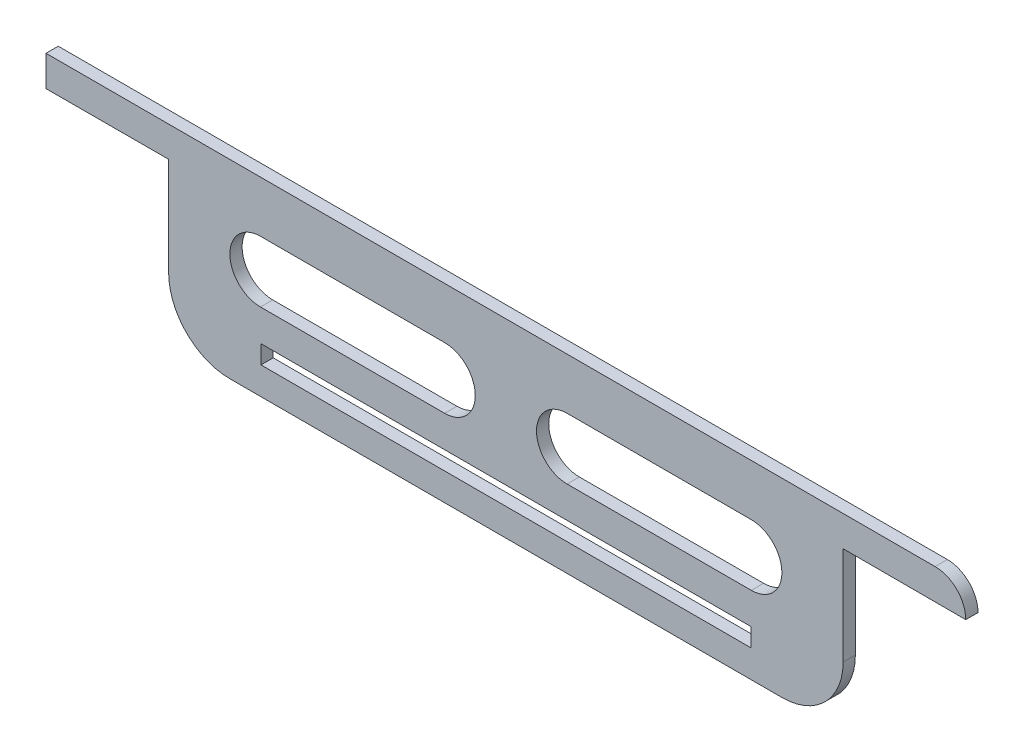
ISO-10303-21;
HEADER;
FILE_DESCRIPTION(('STEP AP214'),'2;1');
FILE_NAME('part.step','',(''),(''),'','','');
FILE_SCHEMA(('AUTOMOTIVE_DESIGN { 1 0 10303 214 1 1 1 1 }'));
ENDSEC;
DATA;
#1=APPLICATION_CONTEXT('core data for automotive mechanical design processes');
#2=APPLICATION_PROTOCOL_DEFINITION('international standard','automotive_design',2000,#1);
#3=PRODUCT_CONTEXT('',#1,'mechanical');
#4=PRODUCT('Part','Part','',(#3));
#5=PRODUCT_RELATED_PRODUCT_CATEGORY('part','',(#4));
#6=PRODUCT_DEFINITION_FORMATION('','',#4);
#7=PRODUCT_DEFINITION_CONTEXT('part definition',#1,'design');
#8=PRODUCT_DEFINITION('design','',#6,#7);
#9=PRODUCT_DEFINITION_SHAPE('','',#8);
#10=(LENGTH_UNIT() NAMED_UNIT(*) SI_UNIT(.MILLI.,.METRE.));
#11=(NAMED_UNIT(*) PLANE_ANGLE_UNIT() SI_UNIT($,.RADIAN.));
#12=(NAMED_UNIT(*) SI_UNIT($,.STERADIAN.) SOLID_ANGLE_UNIT());
#13=UNCERTAINTY_MEASURE_WITH_UNIT(LENGTH_MEASURE(1.E-05),#10,'distance_accuracy_value','');
#14=(GEOMETRIC_REPRESENTATION_CONTEXT(3) GLOBAL_UNCERTAINTY_ASSIGNED_CONTEXT((#13)) GLOBAL_UNIT_ASSIGNED_CONTEXT((#10,
#11,#12)) REPRESENTATION_CONTEXT('',''));
#15=CARTESIAN_POINT('',(0.,0.,0.));
#16=DIRECTION('',(0.,0.,1.));
#17=DIRECTION('',(1.,0.,0.));
#18=AXIS2_PLACEMENT_3D('',#15,#16,#17);
#19=CARTESIAN_POINT('',(40.,0.,2.));
#20=DIRECTION('',(-1.,0.,0.));
#21=DIRECTION('',(0.,0.,1.));
#22=AXIS2_PLACEMENT_3D('',#19,#20,#21);
#23=PLANE('',#22);
#24=DIRECTION('',(0.,1.,0.));
#25=VECTOR('',#24,1.);
#26=CARTESIAN_POINT('',(40.,0.,0.));
#27=LINE('',#26,#25);
#28=CARTESIAN_POINT('',(40.,-24.0218666183001,0.));
#29=VERTEX_POINT('',#28);
#30=CARTESIAN_POINT('',(40.,-21.0218666183001,0.));
#31=VERTEX_POINT('',#30);
#32=EDGE_CURVE('E282',#29,#31,#27,.T.);
#33=ORIENTED_EDGE('',*,*,#32,.F.);
#34=DIRECTION('',(0.,0.,-1.));
#35=VECTOR('',#34,1.);
#36=CARTESIAN_POINT('',(40.,-24.0218666183001,2.));
#37=LINE('',#36,#35);
#38=CARTESIAN_POINT('',(40.,-24.0218666183001,2.));
#39=VERTEX_POINT('',#38);
#40=EDGE_CURVE('E11',#39,#29,#37,.T.);
#41=ORIENTED_EDGE('',*,*,#40,.F.);
#42=DIRECTION('',(0.,1.,0.));
#43=VECTOR('',#42,1.);
#44=CARTESIAN_POINT('',(40.,0.,2.));
#45=LINE('',#44,#43);
#46=CARTESIAN_POINT('',(40.,-21.0218666183001,2.));
#47=VERTEX_POINT('',#46);
#48=EDGE_CURVE('E217',#39,#47,#45,.T.);
#49=ORIENTED_EDGE('',*,*,#48,.T.);
#50=DIRECTION('',(0.,0.,-1.));
#51=VECTOR('',#50,1.);
#52=CARTESIAN_POINT('',(40.,-21.0218666183001,2.));
#53=LINE('',#52,#51);
#54=EDGE_CURVE('E134',#47,#31,#53,.T.);
#55=ORIENTED_EDGE('',*,*,#54,.T.);
#56=EDGE_LOOP('',(#33,#41,#49,#55));
#57=FACE_BOUND('',#56,.T.);
#58=ADVANCED_FACE('F35',(#57),#23,.T.);
#59=CARTESIAN_POINT('',(0.,-24.0218666183001,2.));
#60=DIRECTION('',(0.,1.,0.));
#61=DIRECTION('',(0.,0.,1.));
#62=AXIS2_PLACEMENT_3D('',#59,#60,#61);
#63=PLANE('',#62);
#64=DIRECTION('',(1.,0.,0.));
#65=VECTOR('',#64,1.);
#66=CARTESIAN_POINT('',(0.,-24.0218666183001,0.));
#67=LINE('',#66,#65);
#68=CARTESIAN_POINT('',(-40.,-24.0218666183001,0.));
#69=VERTEX_POINT('',#68);
#70=EDGE_CURVE('E207',#69,#29,#67,.T.);
#71=ORIENTED_EDGE('',*,*,#70,.F.);
#72=DIRECTION('',(0.,0.,-1.));
#73=VECTOR('',#72,1.);
#74=CARTESIAN_POINT('',(-40.,-24.0218666183001,2.));
#75=LINE('',#74,#73);
#76=CARTESIAN_POINT('',(-40.,-24.0218666183001,2.));
#77=VERTEX_POINT('',#76);
#78=EDGE_CURVE('E45',#77,#69,#75,.T.);
#79=ORIENTED_EDGE('',*,*,#78,.F.);
#80=DIRECTION('',(1.,0.,0.));
#81=VECTOR('',#80,1.);
#82=CARTESIAN_POINT('',(0.,-24.0218666183001,2.));
#83=LINE('',#82,#81);
#84=EDGE_CURVE('E205',#77,#39,#83,.T.);
#85=ORIENTED_EDGE('',*,*,#84,.T.);
#86=ORIENTED_EDGE('',*,*,#40,.T.);
#87=EDGE_LOOP('',(#71,#79,#85,#86));
#88=FACE_BOUND('',#87,.T.);
#89=ADVANCED_FACE('F203',(#88),#63,.T.);
#90=CARTESIAN_POINT('',(-40.,0.,2.));
#91=DIRECTION('',(-1.,0.,0.));
#92=DIRECTION('',(0.,0.,1.));
#93=AXIS2_PLACEMENT_3D('',#90,#91,#92);
#94=PLANE('',#93);
#95=DIRECTION('',(0.,1.,0.));
#96=VECTOR('',#95,1.);
#97=CARTESIAN_POINT('',(-40.,0.,0.));
#98=LINE('',#97,#96);
#99=CARTESIAN_POINT('',(-40.,-21.0218666183001,0.));
#100=VERTEX_POINT('',#99);
#101=EDGE_CURVE('E285',#69,#100,#98,.T.);
#102=ORIENTED_EDGE('',*,*,#101,.T.);
#103=DIRECTION('',(0.,0.,-1.));
#104=VECTOR('',#103,1.);
#105=CARTESIAN_POINT('',(-40.,-21.0218666183001,2.));
#106=LINE('',#105,#104);
#107=CARTESIAN_POINT('',(-40.,-21.0218666183001,2.));
#108=VERTEX_POINT('',#107);
#109=EDGE_CURVE('E210',#108,#100,#106,.T.);
#110=ORIENTED_EDGE('',*,*,#109,.F.);
#111=DIRECTION('',(0.,1.,0.));
#112=VECTOR('',#111,1.);
#113=CARTESIAN_POINT('',(-40.,0.,2.));
#114=LINE('',#113,#112);
#115=EDGE_CURVE('E213',#77,#108,#114,.T.);
#116=ORIENTED_EDGE('',*,*,#115,.F.);
#117=ORIENTED_EDGE('',*,*,#78,.T.);
#118=EDGE_LOOP('',(#102,#110,#116,#117));
#119=FACE_BOUND('',#118,.T.);
#120=ADVANCED_FACE('F214',(#119),#94,.F.);
#121=CARTESIAN_POINT('',(70.1093330915004,-2.49635556361665,2.));
#122=DIRECTION('',(0.,0.,-1.));
#123=DIRECTION('',(-1.,0.,0.));
#124=AXIS2_PLACEMENT_3D('',#121,#122,#123);
#125=CYLINDRICAL_SURFACE('',#124,5.);
#126=CARTESIAN_POINT('',(70.1093330915004,-2.49635556361665,0.));
#127=DIRECTION('',(0.,0.,1.));
#128=DIRECTION('',(1.,0.,0.));
#129=AXIS2_PLACEMENT_3D('',#126,#127,#128);
#130=CIRCLE('',#129,5.);
#131=CARTESIAN_POINT('',(70.1093330915004,2.50364443638335,0.));
#132=VERTEX_POINT('',#131);
#133=CARTESIAN_POINT('',(75.1093330915004,-2.49635556361669,0.));
#134=VERTEX_POINT('',#133);
#135=EDGE_CURVE('E249',#132,#134,#130,.F.);
#136=ORIENTED_EDGE('',*,*,#135,.F.);
#137=DIRECTION('',(0.,0.,-1.));
#138=VECTOR('',#137,1.);
#139=CARTESIAN_POINT('',(70.1093330915004,2.50364443638335,2.));
#140=LINE('',#139,#138);
#141=CARTESIAN_POINT('',(70.1093330915004,2.50364443638335,2.));
#142=VERTEX_POINT('',#141);
#143=EDGE_CURVE('E290',#142,#132,#140,.T.);
#144=ORIENTED_EDGE('',*,*,#143,.F.);
#145=CARTESIAN_POINT('',(70.1093330915004,-2.49635556361665,2.));
#146=DIRECTION('',(0.,0.,1.));
#147=DIRECTION('',(1.,0.,0.));
#148=AXIS2_PLACEMENT_3D('',#145,#146,#147);
#149=CIRCLE('',#148,5.);
#150=CARTESIAN_POINT('',(75.1093330915004,-2.49635556361669,2.));
#151=VERTEX_POINT('',#150);
#152=EDGE_CURVE('E368',#142,#151,#149,.F.);
#153=ORIENTED_EDGE('',*,*,#152,.T.);
#154=DIRECTION('',(0.,0.,-1.));
#155=VECTOR('',#154,1.);
#156=CARTESIAN_POINT('',(75.1093330915004,-2.49635556361669,2.));
#157=LINE('',#156,#155);
#158=EDGE_CURVE('E292',#151,#134,#157,.T.);
#159=ORIENTED_EDGE('',*,*,#158,.T.);
#160=EDGE_LOOP('',(#136,#144,#153,#159));
#161=FACE_BOUND('',#160,.T.);
#162=ADVANCED_FACE('F405',(#161),#125,.T.);
#163=CARTESIAN_POINT('',(0.,2.50364443638335,2.));
#164=DIRECTION('',(0.,1.,0.));
#165=DIRECTION('',(0.,0.,1.));
#166=AXIS2_PLACEMENT_3D('',#163,#164,#165);
#167=PLANE('',#166);
#168=DIRECTION('',(1.,0.,0.));
#169=VECTOR('',#168,1.);
#170=CARTESIAN_POINT('',(0.,2.50364443638335,0.));
#171=LINE('',#170,#169);
#172=CARTESIAN_POINT('',(-75.1093330915004,2.50364443638335,0.));
#173=VERTEX_POINT('',#172);
#174=EDGE_CURVE('E252',#173,#132,#171,.T.);
#175=ORIENTED_EDGE('',*,*,#174,.F.);
#176=DIRECTION('',(0.,0.,-1.));
#177=VECTOR('',#176,1.);
#178=CARTESIAN_POINT('',(-75.1093330915004,2.50364443638335,2.));
#179=LINE('',#178,#177);
#180=CARTESIAN_POINT('',(-75.1093330915004,2.50364443638335,2.));
#181=VERTEX_POINT('',#180);
#182=EDGE_CURVE('E316',#181,#173,#179,.T.);
#183=ORIENTED_EDGE('',*,*,#182,.F.);
#184=DIRECTION('',(1.,0.,0.));
#185=VECTOR('',#184,1.);
#186=CARTESIAN_POINT('',(0.,2.50364443638335,2.));
#187=LINE('',#186,#185);
#188=EDGE_CURVE('E371',#181,#142,#187,.T.);
#189=ORIENTED_EDGE('',*,*,#188,.T.);
#190=ORIENTED_EDGE('',*,*,#143,.T.);
#191=EDGE_LOOP('',(#175,#183,#189,#190));
#192=FACE_BOUND('',#191,.T.);
#193=ADVANCED_FACE('F408',(#192),#167,.T.);
#194=CARTESIAN_POINT('',(-75.1093330915004,0.,2.));
#195=DIRECTION('',(1.,0.,0.));
#196=DIRECTION('',(0.,0.,-1.));
#197=AXIS2_PLACEMENT_3D('',#194,#195,#196);
#198=PLANE('',#197);
#199=DIRECTION('',(0.,-1.,0.));
#200=VECTOR('',#199,1.);
#201=CARTESIAN_POINT('',(-75.1093330915004,0.,0.));
#202=LINE('',#201,#200);
#203=CARTESIAN_POINT('',(-75.1093330915005,-2.50364443638335,0.));
#204=VERTEX_POINT('',#203);
#205=EDGE_CURVE('E255',#173,#204,#202,.T.);
#206=ORIENTED_EDGE('',*,*,#205,.T.);
#207=DIRECTION('',(0.,0.,-1.));
#208=VECTOR('',#207,1.);
#209=CARTESIAN_POINT('',(-75.1093330915005,-2.50364443638335,2.));
#210=LINE('',#209,#208);
#211=CARTESIAN_POINT('',(-75.1093330915005,-2.50364443638335,2.));
#212=VERTEX_POINT('',#211);
#213=EDGE_CURVE('E313',#212,#204,#210,.T.);
#214=ORIENTED_EDGE('',*,*,#213,.F.);
#215=DIRECTION('',(0.,-1.,0.));
#216=VECTOR('',#215,1.);
#217=CARTESIAN_POINT('',(-75.1093330915004,0.,2.));
#218=LINE('',#217,#216);
#219=EDGE_CURVE('E374',#181,#212,#218,.T.);
#220=ORIENTED_EDGE('',*,*,#219,.F.);
#221=ORIENTED_EDGE('',*,*,#182,.T.);
#222=EDGE_LOOP('',(#206,#214,#220,#221));
#223=FACE_BOUND('',#222,.T.);
#224=ADVANCED_FACE('F414',(#223),#198,.F.);
#225=CARTESIAN_POINT('',(0.00306702688126153,-2.40797407486067,2.));
#226=DIRECTION('',(-0.00127369493943616,0.999999188850272,0.));
#227=DIRECTION('',(-0.999999188850272,-0.00127369493943616,0.));
#228=AXIS2_PLACEMENT_3D('',#225,#226,#227);
#229=PLANE('',#228);
#230=DIRECTION('',(0.999999188850272,0.00127369493943616,0.));
#231=VECTOR('',#230,1.);
#232=CARTESIAN_POINT('',(0.00306702688126153,-2.40797407486067,0.));
#233=LINE('',#232,#231);
#234=CARTESIAN_POINT('',(-55.0801776004337,-2.47813338169991,0.));
#235=VERTEX_POINT('',#234);
#236=EDGE_CURVE('E258',#204,#235,#233,.T.);
#237=ORIENTED_EDGE('',*,*,#236,.T.);
#238=DIRECTION('',(0.,0.,-1.));
#239=VECTOR('',#238,1.);
#240=CARTESIAN_POINT('',(-55.0801776004337,-2.47813338169991,2.));
#241=LINE('',#240,#239);
#242=CARTESIAN_POINT('',(-55.0801776004337,-2.47813338169991,2.));
#243=VERTEX_POINT('',#242);
#244=EDGE_CURVE('E311',#243,#235,#241,.T.);
#245=ORIENTED_EDGE('',*,*,#244,.F.);
#246=DIRECTION('',(0.999999188850272,0.00127369493943616,0.));
#247=VECTOR('',#246,1.);
#248=CARTESIAN_POINT('',(0.00306702688126153,-2.40797407486067,2.));
#249=LINE('',#248,#247);
#250=EDGE_CURVE('E377',#212,#243,#249,.T.);
#251=ORIENTED_EDGE('',*,*,#250,.F.);
#252=ORIENTED_EDGE('',*,*,#213,.T.);
#253=EDGE_LOOP('',(#237,#245,#251,#252));
#254=FACE_BOUND('',#253,.T.);
#255=ADVANCED_FACE('F417',(#254),#229,.F.);
#256=CARTESIAN_POINT('',(-55.0801776004337,0.,2.));
#257=DIRECTION('',(-1.,0.,0.));
#258=DIRECTION('',(0.,0.,1.));
#259=AXIS2_PLACEMENT_3D('',#256,#257,#258);
#260=PLANE('',#259);
#261=DIRECTION('',(0.,1.,0.));
#262=VECTOR('',#261,1.);
#263=CARTESIAN_POINT('',(-55.0801776004337,0.,0.));
#264=LINE('',#263,#262);
#265=CARTESIAN_POINT('',(-55.0801776004337,-18.5218666183001,0.));
#266=VERTEX_POINT('',#265);
#267=EDGE_CURVE('E261',#266,#235,#264,.T.);
#268=ORIENTED_EDGE('',*,*,#267,.F.);
#269=DIRECTION('',(0.,0.,-1.));
#270=VECTOR('',#269,1.);
#271=CARTESIAN_POINT('',(-55.0801776004337,-18.5218666183001,2.));
#272=LINE('',#271,#270);
#273=CARTESIAN_POINT('',(-55.0801776004337,-18.5218666183001,2.));
#274=VERTEX_POINT('',#273);
#275=EDGE_CURVE('E309',#274,#266,#272,.T.);
#276=ORIENTED_EDGE('',*,*,#275,.F.);
#277=DIRECTION('',(0.,1.,0.));
#278=VECTOR('',#277,1.);
#279=CARTESIAN_POINT('',(-55.0801776004337,0.,2.));
#280=LINE('',#279,#278);
#281=EDGE_CURVE('E379',#274,#243,#280,.T.);
#282=ORIENTED_EDGE('',*,*,#281,.T.);
#283=ORIENTED_EDGE('',*,*,#244,.T.);
#284=EDGE_LOOP('',(#268,#276,#282,#283));
#285=FACE_BOUND('',#284,.T.);
#286=ADVANCED_FACE('F420',(#285),#260,.T.);
#287=CARTESIAN_POINT('',(-45.0801776004337,-18.5218666183001,2.));
#288=DIRECTION('',(0.,0.,-1.));
#289=DIRECTION('',(-1.,0.,0.));
#290=AXIS2_PLACEMENT_3D('',#287,#288,#289);
#291=CYLINDRICAL_SURFACE('',#290,10.);
#292=CARTESIAN_POINT('',(-45.0801776004337,-18.5218666183001,0.));
#293=DIRECTION('',(0.,0.,1.));
#294=DIRECTION('',(1.,0.,0.));
#295=AXIS2_PLACEMENT_3D('',#292,#293,#294);
#296=CIRCLE('',#295,10.);
#297=CARTESIAN_POINT('',(-45.0801776004337,-28.5218666183001,0.));
#298=VERTEX_POINT('',#297);
#299=EDGE_CURVE('E264',#298,#266,#296,.F.);
#300=ORIENTED_EDGE('',*,*,#299,.F.);
#301=DIRECTION('',(0.,0.,-1.));
#302=VECTOR('',#301,1.);
#303=CARTESIAN_POINT('',(-45.0801776004337,-28.5218666183001,2.));
#304=LINE('',#303,#302);
#305=CARTESIAN_POINT('',(-45.0801776004337,-28.5218666183001,2.));
#306=VERTEX_POINT('',#305);
#307=EDGE_CURVE('E307',#306,#298,#304,.T.);
#308=ORIENTED_EDGE('',*,*,#307,.F.);
#309=CARTESIAN_POINT('',(-45.0801776004337,-18.5218666183001,2.));
#310=DIRECTION('',(0.,0.,1.));
#311=DIRECTION('',(1.,0.,0.));
#312=AXIS2_PLACEMENT_3D('',#309,#310,#311);
#313=CIRCLE('',#312,10.);
#314=EDGE_CURVE('E382',#306,#274,#313,.F.);
#315=ORIENTED_EDGE('',*,*,#314,.T.);
#316=ORIENTED_EDGE('',*,*,#275,.T.);
#317=EDGE_LOOP('',(#300,#308,#315,#316));
#318=FACE_BOUND('',#317,.T.);
#319=ADVANCED_FACE('F424',(#318),#291,.T.);
#320=CARTESIAN_POINT('',(0.,-28.5218666183001,2.));
#321=DIRECTION('',(0.,1.,0.));
#322=DIRECTION('',(0.,0.,1.));
#323=AXIS2_PLACEMENT_3D('',#320,#321,#322);
#324=PLANE('',#323);
#325=DIRECTION('',(1.,0.,0.));
#326=VECTOR('',#325,1.);
#327=CARTESIAN_POINT('',(0.,-28.5218666183001,0.));
#328=LINE('',#327,#326);
#329=CARTESIAN_POINT('',(45.0801776004337,-28.5218666183001,0.));
#330=VERTEX_POINT('',#329);
#331=EDGE_CURVE('E267',#298,#330,#328,.T.);
#332=ORIENTED_EDGE('',*,*,#331,.T.);
#333=DIRECTION('',(0.,0.,-1.));
#334=VECTOR('',#333,1.);
#335=CARTESIAN_POINT('',(45.0801776004337,-28.5218666183001,2.));
#336=LINE('',#335,#334);
#337=CARTESIAN_POINT('',(45.0801776004337,-28.5218666183001,2.));
#338=VERTEX_POINT('',#337);
#339=EDGE_CURVE('E304',#338,#330,#336,.T.);
#340=ORIENTED_EDGE('',*,*,#339,.F.);
#341=DIRECTION('',(1.,0.,0.));
#342=VECTOR('',#341,1.);
#343=CARTESIAN_POINT('',(0.,-28.5218666183001,2.));
#344=LINE('',#343,#342);
#345=EDGE_CURVE('E385',#306,#338,#344,.T.);
#346=ORIENTED_EDGE('',*,*,#345,.F.);
#347=ORIENTED_EDGE('',*,*,#307,.T.);
#348=EDGE_LOOP('',(#332,#340,#346,#347));
#349=FACE_BOUND('',#348,.T.);
#350=ADVANCED_FACE('F429',(#349),#324,.F.);
#351=CARTESIAN_POINT('',(45.0801776004337,-18.5218666183001,2.));
#352=DIRECTION('',(0.,0.,-1.));
#353=DIRECTION('',(-1.,0.,0.));
#354=AXIS2_PLACEMENT_3D('',#351,#352,#353);
#355=CYLINDRICAL_SURFACE('',#354,10.);
#356=CARTESIAN_POINT('',(45.0801776004337,-18.5218666183001,0.));
#357=DIRECTION('',(0.,0.,1.));
#358=DIRECTION('',(1.,0.,0.));
#359=AXIS2_PLACEMENT_3D('',#356,#357,#358);
#360=CIRCLE('',#359,10.);
#361=CARTESIAN_POINT('',(55.0801776004337,-18.5218666183001,0.));
#362=VERTEX_POINT('',#361);
#363=EDGE_CURVE('E270',#330,#362,#360,.T.);
#364=ORIENTED_EDGE('',*,*,#363,.T.);
#365=DIRECTION('',(0.,0.,-1.));
#366=VECTOR('',#365,1.);
#367=CARTESIAN_POINT('',(55.0801776004337,-18.5218666183001,2.));
#368=LINE('',#367,#366);
#369=CARTESIAN_POINT('',(55.0801776004337,-18.5218666183001,2.));
#370=VERTEX_POINT('',#369);
#371=EDGE_CURVE('E301',#370,#362,#368,.T.);
#372=ORIENTED_EDGE('',*,*,#371,.F.);
#373=CARTESIAN_POINT('',(45.0801776004337,-18.5218666183001,2.));
#374=DIRECTION('',(0.,0.,1.));
#375=DIRECTION('',(1.,0.,0.));
#376=AXIS2_PLACEMENT_3D('',#373,#374,#375);
#377=CIRCLE('',#376,10.);
#378=EDGE_CURVE('E388',#338,#370,#377,.T.);
#379=ORIENTED_EDGE('',*,*,#378,.F.);
#380=ORIENTED_EDGE('',*,*,#339,.T.);
#381=EDGE_LOOP('',(#364,#372,#379,#380));
#382=FACE_BOUND('',#381,.T.);
#383=ADVANCED_FACE('F433',(#382),#355,.T.);
#384=CARTESIAN_POINT('',(55.0801776004337,0.,2.));
#385=DIRECTION('',(-1.,0.,0.));
#386=DIRECTION('',(0.,0.,1.));
#387=AXIS2_PLACEMENT_3D('',#384,#385,#386);
#388=PLANE('',#387);
#389=DIRECTION('',(0.,1.,0.));
#390=VECTOR('',#389,1.);
#391=CARTESIAN_POINT('',(55.0801776004337,0.,0.));
#392=LINE('',#391,#390);
#393=CARTESIAN_POINT('',(55.0801776004337,-2.47813338169991,0.));
#394=VERTEX_POINT('',#393);
#395=EDGE_CURVE('E273',#362,#394,#392,.T.);
#396=ORIENTED_EDGE('',*,*,#395,.T.);
#397=DIRECTION('',(0.,0.,-1.));
#398=VECTOR('',#397,1.);
#399=CARTESIAN_POINT('',(55.0801776004337,-2.47813338169991,2.));
#400=LINE('',#399,#398);
#401=CARTESIAN_POINT('',(55.0801776004337,-2.47813338169991,2.));
#402=VERTEX_POINT('',#401);
#403=EDGE_CURVE('E298',#402,#394,#400,.T.);
#404=ORIENTED_EDGE('',*,*,#403,.F.);
#405=DIRECTION('',(0.,1.,0.));
#406=VECTOR('',#405,1.);
#407=CARTESIAN_POINT('',(55.0801776004337,0.,2.));
#408=LINE('',#407,#406);
#409=EDGE_CURVE('E391',#370,#402,#408,.T.);
#410=ORIENTED_EDGE('',*,*,#409,.F.);
#411=ORIENTED_EDGE('',*,*,#371,.T.);
#412=EDGE_LOOP('',(#396,#404,#410,#411));
#413=FACE_BOUND('',#412,.T.);
#414=ADVANCED_FACE('F435',(#413),#388,.F.);
#415=CARTESIAN_POINT('',(-0.00306702688126153,-2.40797407486067,2.));
#416=DIRECTION('',(0.00127369493943616,0.999999188850272,0.));
#417=DIRECTION('',(-0.999999188850272,0.00127369493943616,0.));
#418=AXIS2_PLACEMENT_3D('',#415,#416,#417);
#419=PLANE('',#418);
#420=DIRECTION('',(0.999999188850272,-0.00127369493943616,0.));
#421=VECTOR('',#420,1.);
#422=CARTESIAN_POINT('',(-0.00306702688126153,-2.40797407486067,0.));
#423=LINE('',#422,#421);
#424=CARTESIAN_POINT('',(75.1093330915004,-2.50364443638335,0.));
#425=VERTEX_POINT('',#424);
#426=EDGE_CURVE('E276',#394,#425,#423,.T.);
#427=ORIENTED_EDGE('',*,*,#426,.T.);
#428=DIRECTION('',(0.,0.,-1.));
#429=VECTOR('',#428,1.);
#430=CARTESIAN_POINT('',(75.1093330915004,-2.50364443638335,2.));
#431=LINE('',#430,#429);
#432=CARTESIAN_POINT('',(75.1093330915004,-2.50364443638335,2.));
#433=VERTEX_POINT('',#432);
#434=EDGE_CURVE('E294',#433,#425,#431,.T.);
#435=ORIENTED_EDGE('',*,*,#434,.F.);
#436=DIRECTION('',(0.999999188850272,-0.00127369493943616,0.));
#437=VECTOR('',#436,1.);
#438=CARTESIAN_POINT('',(-0.00306702688126153,-2.40797407486067,2.));
#439=LINE('',#438,#437);
#440=EDGE_CURVE('E394',#402,#433,#439,.T.);
#441=ORIENTED_EDGE('',*,*,#440,.F.);
#442=ORIENTED_EDGE('',*,*,#403,.T.);
#443=EDGE_LOOP('',(#427,#435,#441,#442));
#444=FACE_BOUND('',#443,.T.);
#445=ADVANCED_FACE('F437',(#444),#419,.F.);
#446=CARTESIAN_POINT('',(-9.99999999999999,-10.8680576994254,2.));
#447=DIRECTION('',(0.,0.,-1.));
#448=DIRECTION('',(-1.,0.,0.));
#449=AXIS2_PLACEMENT_3D('',#446,#447,#448);
#450=CYLINDRICAL_SURFACE('',#449,5.);
#451=CARTESIAN_POINT('',(-9.99999999999999,-10.8680576994254,0.));
#452=DIRECTION('',(0.,0.,1.));
#453=DIRECTION('',(1.,0.,0.));
#454=AXIS2_PLACEMENT_3D('',#451,#452,#453);
#455=CIRCLE('',#454,5.);
#456=CARTESIAN_POINT('',(-9.99999999999999,-15.8680576994254,0.));
#457=VERTEX_POINT('',#456);
#458=CARTESIAN_POINT('',(-9.99999999999999,-5.86805769942545,0.));
#459=VERTEX_POINT('',#458);
#460=EDGE_CURVE('E237',#457,#459,#455,.T.);
#461=ORIENTED_EDGE('',*,*,#460,.F.);
#462=DIRECTION('',(0.,0.,-1.));
#463=VECTOR('',#462,1.);
#464=CARTESIAN_POINT('',(-9.99999999999999,-15.8680576994254,2.));
#465=LINE('',#464,#463);
#466=CARTESIAN_POINT('',(-9.99999999999999,-15.8680576994254,2.));
#467=VERTEX_POINT('',#466);
#468=EDGE_CURVE('E295',#467,#457,#465,.T.);
#469=ORIENTED_EDGE('',*,*,#468,.F.);
#470=CARTESIAN_POINT('',(-9.99999999999999,-10.8680576994254,2.));
#471=DIRECTION('',(0.,0.,1.));
#472=DIRECTION('',(1.,0.,0.));
#473=AXIS2_PLACEMENT_3D('',#470,#471,#472);
#474=CIRCLE('',#473,5.);
#475=CARTESIAN_POINT('',(-9.99999999999999,-5.86805769942545,2.));
#476=VERTEX_POINT('',#475);
#477=EDGE_CURVE('E351',#467,#476,#474,.T.);
#478=ORIENTED_EDGE('',*,*,#477,.T.);
#479=DIRECTION('',(0.,0.,-1.));
#480=VECTOR('',#479,1.);
#481=CARTESIAN_POINT('',(-9.99999999999999,-5.86805769942545,2.));
#482=LINE('',#481,#480);
#483=EDGE_CURVE('E319',#476,#459,#482,.T.);
#484=ORIENTED_EDGE('',*,*,#483,.T.);
#485=EDGE_LOOP('',(#461,#469,#478,#484));
#486=FACE_BOUND('',#485,.T.);
#487=ADVANCED_FACE('F454',(#486),#450,.F.);
#488=CARTESIAN_POINT('',(0.,-15.8680576994254,2.));
#489=DIRECTION('',(0.,1.,0.));
#490=DIRECTION('',(0.,0.,1.));
#491=AXIS2_PLACEMENT_3D('',#488,#489,#490);
#492=PLANE('',#491);
#493=DIRECTION('',(1.,0.,0.));
#494=VECTOR('',#493,1.);
#495=CARTESIAN_POINT('',(0.,-15.8680576994254,0.));
#496=LINE('',#495,#494);
#497=CARTESIAN_POINT('',(-40.0801776004337,-15.8680576994254,0.));
#498=VERTEX_POINT('',#497);
#499=EDGE_CURVE('E240',#498,#457,#496,.T.);
#500=ORIENTED_EDGE('',*,*,#499,.F.);
#501=DIRECTION('',(0.,0.,-1.));
#502=VECTOR('',#501,1.);
#503=CARTESIAN_POINT('',(-40.0801776004337,-15.8680576994254,2.));
#504=LINE('',#503,#502);
#505=CARTESIAN_POINT('',(-40.0801776004337,-15.8680576994254,2.));
#506=VERTEX_POINT('',#505);
#507=EDGE_CURVE('E323',#506,#498,#504,.T.);
#508=ORIENTED_EDGE('',*,*,#507,.F.);
#509=DIRECTION('',(1.,0.,0.));
#510=VECTOR('',#509,1.);
#511=CARTESIAN_POINT('',(0.,-15.8680576994254,2.));
#512=LINE('',#511,#510);
#513=EDGE_CURVE('E360',#506,#467,#512,.T.);
#514=ORIENTED_EDGE('',*,*,#513,.T.);
#515=ORIENTED_EDGE('',*,*,#468,.T.);
#516=EDGE_LOOP('',(#500,#508,#514,#515));
#517=FACE_BOUND('',#516,.T.);
#518=ADVANCED_FACE('F479',(#517),#492,.T.);
#519=CARTESIAN_POINT('',(-40.0801776004337,-10.8680576994254,2.));
#520=DIRECTION('',(0.,0.,-1.));
#521=DIRECTION('',(-1.,0.,0.));
#522=AXIS2_PLACEMENT_3D('',#519,#520,#521);
#523=CYLINDRICAL_SURFACE('',#522,5.);
#524=CARTESIAN_POINT('',(-40.0801776004337,-10.8680576994254,0.));
#525=DIRECTION('',(0.,0.,1.));
#526=DIRECTION('',(1.,0.,0.));
#527=AXIS2_PLACEMENT_3D('',#524,#525,#526);
#528=CIRCLE('',#527,5.);
#529=CARTESIAN_POINT('',(-40.0801776004337,-5.86805769942545,0.));
#530=VERTEX_POINT('',#529);
#531=EDGE_CURVE('E243',#530,#498,#528,.T.);
#532=ORIENTED_EDGE('',*,*,#531,.F.);
#533=DIRECTION('',(0.,0.,-1.));
#534=VECTOR('',#533,1.);
#535=CARTESIAN_POINT('',(-40.0801776004337,-5.86805769942545,2.));
#536=LINE('',#535,#534);
#537=CARTESIAN_POINT('',(-40.0801776004337,-5.86805769942545,2.));
#538=VERTEX_POINT('',#537);
#539=EDGE_CURVE('E321',#538,#530,#536,.T.);
#540=ORIENTED_EDGE('',*,*,#539,.F.);
#541=CARTESIAN_POINT('',(-40.0801776004337,-10.8680576994254,2.));
#542=DIRECTION('',(0.,0.,1.));
#543=DIRECTION('',(1.,0.,0.));
#544=AXIS2_PLACEMENT_3D('',#541,#542,#543);
#545=CIRCLE('',#544,5.);
#546=EDGE_CURVE('E363',#538,#506,#545,.T.);
#547=ORIENTED_EDGE('',*,*,#546,.T.);
#548=ORIENTED_EDGE('',*,*,#507,.T.);
#549=EDGE_LOOP('',(#532,#540,#547,#548));
#550=FACE_BOUND('',#549,.T.);
#551=ADVANCED_FACE('F476',(#550),#523,.F.);
#552=CARTESIAN_POINT('',(40.0801776004337,-10.8680576994254,2.));
#553=DIRECTION('',(0.,0.,-1.));
#554=DIRECTION('',(-1.,0.,0.));
#555=AXIS2_PLACEMENT_3D('',#552,#553,#554);
#556=CYLINDRICAL_SURFACE('',#555,5.);
#557=CARTESIAN_POINT('',(40.0801776004337,-10.8680576994254,0.));
#558=DIRECTION('',(0.,0.,1.));
#559=DIRECTION('',(1.,0.,0.));
#560=AXIS2_PLACEMENT_3D('',#557,#558,#559);
#561=CIRCLE('',#560,5.);
#562=CARTESIAN_POINT('',(40.0801776004337,-15.8680576994254,0.));
#563=VERTEX_POINT('',#562);
#564=CARTESIAN_POINT('',(40.0801776004337,-5.86805769942545,0.));
#565=VERTEX_POINT('',#564);
#566=EDGE_CURVE('E225',#563,#565,#561,.T.);
#567=ORIENTED_EDGE('',*,*,#566,.F.);
#568=DIRECTION('',(0.,0.,-1.));
#569=VECTOR('',#568,1.);
#570=CARTESIAN_POINT('',(40.0801776004337,-15.8680576994254,2.));
#571=LINE('',#570,#569);
#572=CARTESIAN_POINT('',(40.0801776004337,-15.8680576994254,2.));
#573=VERTEX_POINT('',#572);
#574=EDGE_CURVE('E39',#573,#563,#571,.T.);
#575=ORIENTED_EDGE('',*,*,#574,.F.);
#576=CARTESIAN_POINT('',(40.0801776004337,-10.8680576994254,2.));
#577=DIRECTION('',(0.,0.,1.));
#578=DIRECTION('',(1.,0.,0.));
#579=AXIS2_PLACEMENT_3D('',#576,#577,#578);
#580=CIRCLE('',#579,5.);
#581=CARTESIAN_POINT('',(40.0801776004337,-5.86805769942545,2.));
#582=VERTEX_POINT('',#581);
#583=EDGE_CURVE('E288',#573,#582,#580,.T.);
#584=ORIENTED_EDGE('',*,*,#583,.T.);
#585=DIRECTION('',(0.,0.,-1.));
#586=VECTOR('',#585,1.);
#587=CARTESIAN_POINT('',(40.0801776004337,-5.86805769942545,2.));
#588=LINE('',#587,#586);
#589=EDGE_CURVE('E224',#582,#565,#588,.T.);
#590=ORIENTED_EDGE('',*,*,#589,.T.);
#591=EDGE_LOOP('',(#567,#575,#584,#590));
#592=FACE_BOUND('',#591,.T.);
#593=ADVANCED_FACE('F37',(#592),#556,.F.);
#594=CARTESIAN_POINT('',(0.,-15.8680576994254,2.));
#595=DIRECTION('',(0.,1.,0.));
#596=DIRECTION('',(0.,0.,1.));
#597=AXIS2_PLACEMENT_3D('',#594,#595,#596);
#598=PLANE('',#597);
#599=DIRECTION('',(1.,0.,0.));
#600=VECTOR('',#599,1.);
#601=CARTESIAN_POINT('',(0.,-15.8680576994254,0.));
#602=LINE('',#601,#600);
#603=CARTESIAN_POINT('',(10.,-15.8680576994254,0.));
#604=VERTEX_POINT('',#603);
#605=EDGE_CURVE('E228',#604,#563,#602,.T.);
#606=ORIENTED_EDGE('',*,*,#605,.F.);
#607=DIRECTION('',(0.,0.,-1.));
#608=VECTOR('',#607,1.);
#609=CARTESIAN_POINT('',(10.,-15.8680576994254,2.));
#610=LINE('',#609,#608);
#611=CARTESIAN_POINT('',(10.,-15.8680576994254,2.));
#612=VERTEX_POINT('',#611);
#613=EDGE_CURVE('E328',#612,#604,#610,.T.);
#614=ORIENTED_EDGE('',*,*,#613,.F.);
#615=DIRECTION('',(1.,0.,0.));
#616=VECTOR('',#615,1.);
#617=CARTESIAN_POINT('',(0.,-15.8680576994254,2.));
#618=LINE('',#617,#616);
#619=EDGE_CURVE('E337',#612,#573,#618,.T.);
#620=ORIENTED_EDGE('',*,*,#619,.T.);
#621=ORIENTED_EDGE('',*,*,#574,.T.);
#622=EDGE_LOOP('',(#606,#614,#620,#621));
#623=FACE_BOUND('',#622,.T.);
#624=ADVANCED_FACE('F335',(#623),#598,.T.);
#625=CARTESIAN_POINT('',(10.,-10.8680576994254,2.));
#626=DIRECTION('',(0.,0.,-1.));
#627=DIRECTION('',(-1.,0.,0.));
#628=AXIS2_PLACEMENT_3D('',#625,#626,#627);
#629=CYLINDRICAL_SURFACE('',#628,5.);
#630=CARTESIAN_POINT('',(10.,-10.8680576994254,0.));
#631=DIRECTION('',(0.,0.,1.));
#632=DIRECTION('',(1.,0.,0.));
#633=AXIS2_PLACEMENT_3D('',#630,#631,#632);
#634=CIRCLE('',#633,5.);
#635=CARTESIAN_POINT('',(10.,-5.86805769942545,0.));
#636=VERTEX_POINT('',#635);
#637=EDGE_CURVE('E231',#636,#604,#634,.T.);
#638=ORIENTED_EDGE('',*,*,#637,.F.);
#639=DIRECTION('',(0.,0.,-1.));
#640=VECTOR('',#639,1.);
#641=CARTESIAN_POINT('',(10.,-5.86805769942545,2.));
#642=LINE('',#641,#640);
#643=CARTESIAN_POINT('',(10.,-5.86805769942545,2.));
#644=VERTEX_POINT('',#643);
#645=EDGE_CURVE('E327',#644,#636,#642,.T.);
#646=ORIENTED_EDGE('',*,*,#645,.F.);
#647=CARTESIAN_POINT('',(10.,-10.8680576994254,2.));
#648=DIRECTION('',(0.,0.,1.));
#649=DIRECTION('',(1.,0.,0.));
#650=AXIS2_PLACEMENT_3D('',#647,#648,#649);
#651=CIRCLE('',#650,5.);
#652=EDGE_CURVE('E346',#644,#612,#651,.T.);
#653=ORIENTED_EDGE('',*,*,#652,.T.);
#654=ORIENTED_EDGE('',*,*,#613,.T.);
#655=EDGE_LOOP('',(#638,#646,#653,#654));
#656=FACE_BOUND('',#655,.T.);
#657=ADVANCED_FACE('F343',(#656),#629,.F.);
#658=CARTESIAN_POINT('',(75.1093330915004,0.,2.));
#659=DIRECTION('',(-1.,0.,0.));
#660=DIRECTION('',(0.,0.,1.));
#661=AXIS2_PLACEMENT_3D('',#658,#659,#660);
#662=PLANE('',#661);
#663=DIRECTION('',(0.,1.,0.));
#664=VECTOR('',#663,1.);
#665=CARTESIAN_POINT('',(75.1093330915004,0.,0.));
#666=LINE('',#665,#664);
#667=EDGE_CURVE('E279',#425,#134,#666,.T.);
#668=ORIENTED_EDGE('',*,*,#667,.T.);
#669=ORIENTED_EDGE('',*,*,#158,.F.);
#670=DIRECTION('',(0.,1.,0.));
#671=VECTOR('',#670,1.);
#672=CARTESIAN_POINT('',(75.1093330915004,0.,2.));
#673=LINE('',#672,#671);
#674=EDGE_CURVE('E219',#433,#151,#673,.T.);
#675=ORIENTED_EDGE('',*,*,#674,.F.);
#676=ORIENTED_EDGE('',*,*,#434,.T.);
#677=EDGE_LOOP('',(#668,#669,#675,#676));
#678=FACE_BOUND('',#677,.T.);
#679=ADVANCED_FACE('F402',(#678),#662,.F.);
#680=CARTESIAN_POINT('',(0.,-5.86805769942545,2.));
#681=DIRECTION('',(0.,1.,0.));
#682=DIRECTION('',(-1.,0.,0.));
#683=AXIS2_PLACEMENT_3D('',#680,#681,#682);
#684=PLANE('',#683);
#685=DIRECTION('',(1.,0.,0.));
#686=VECTOR('',#685,1.);
#687=CARTESIAN_POINT('',(0.,-5.86805769942545,0.));
#688=LINE('',#687,#686);
#689=EDGE_CURVE('E246',#530,#459,#688,.T.);
#690=ORIENTED_EDGE('',*,*,#689,.T.);
#691=ORIENTED_EDGE('',*,*,#483,.F.);
#692=DIRECTION('',(1.,0.,0.));
#693=VECTOR('',#692,1.);
#694=CARTESIAN_POINT('',(0.,-5.86805769942545,2.));
#695=LINE('',#694,#693);
#696=EDGE_CURVE('E366',#538,#476,#695,.T.);
#697=ORIENTED_EDGE('',*,*,#696,.F.);
#698=ORIENTED_EDGE('',*,*,#539,.T.);
#699=EDGE_LOOP('',(#690,#691,#697,#698));
#700=FACE_BOUND('',#699,.T.);
#701=ADVANCED_FACE('F451',(#700),#684,.F.);
#702=CARTESIAN_POINT('',(0.,-5.86805769942545,2.));
#703=DIRECTION('',(0.,1.,0.));
#704=DIRECTION('',(-1.,0.,0.));
#705=AXIS2_PLACEMENT_3D('',#702,#703,#704);
#706=PLANE('',#705);
#707=DIRECTION('',(1.,0.,0.));
#708=VECTOR('',#707,1.);
#709=CARTESIAN_POINT('',(0.,-5.86805769942545,0.));
#710=LINE('',#709,#708);
#711=EDGE_CURVE('E234',#636,#565,#710,.T.);
#712=ORIENTED_EDGE('',*,*,#711,.T.);
#713=ORIENTED_EDGE('',*,*,#589,.F.);
#714=DIRECTION('',(1.,0.,0.));
#715=VECTOR('',#714,1.);
#716=CARTESIAN_POINT('',(0.,-5.86805769942545,2.));
#717=LINE('',#716,#715);
#718=EDGE_CURVE('E348',#644,#582,#717,.T.);
#719=ORIENTED_EDGE('',*,*,#718,.F.);
#720=ORIENTED_EDGE('',*,*,#645,.T.);
#721=EDGE_LOOP('',(#712,#713,#719,#720));
#722=FACE_BOUND('',#721,.T.);
#723=ADVANCED_FACE('F349',(#722),#706,.F.);
#724=CARTESIAN_POINT('',(0.,-21.0218666183001,2.));
#725=DIRECTION('',(0.,1.,0.));
#726=DIRECTION('',(0.,0.,1.));
#727=AXIS2_PLACEMENT_3D('',#724,#725,#726);
#728=PLANE('',#727);
#729=DIRECTION('',(1.,0.,0.));
#730=VECTOR('',#729,1.);
#731=CARTESIAN_POINT('',(0.,-21.0218666183001,0.));
#732=LINE('',#731,#730);
#733=EDGE_CURVE('E127',#100,#31,#732,.T.);
#734=ORIENTED_EDGE('',*,*,#733,.T.);
#735=ORIENTED_EDGE('',*,*,#54,.F.);
#736=DIRECTION('',(1.,0.,0.));
#737=VECTOR('',#736,1.);
#738=CARTESIAN_POINT('',(0.,-21.0218666183001,2.));
#739=LINE('',#738,#737);
#740=EDGE_CURVE('E54',#108,#47,#739,.T.);
#741=ORIENTED_EDGE('',*,*,#740,.F.);
#742=ORIENTED_EDGE('',*,*,#109,.T.);
#743=EDGE_LOOP('',(#734,#735,#741,#742));
#744=FACE_BOUND('',#743,.T.);
#745=ADVANCED_FACE('F489',(#744),#728,.F.);
#746=CARTESIAN_POINT('',(0.,0.,2.));
#747=DIRECTION('',(0.,0.,1.));
#748=DIRECTION('',(1.,0.,0.));
#749=AXIS2_PLACEMENT_3D('',#746,#747,#748);
#750=PLANE('',#749);
#751=ORIENTED_EDGE('',*,*,#583,.F.);
#752=ORIENTED_EDGE('',*,*,#619,.F.);
#753=ORIENTED_EDGE('',*,*,#652,.F.);
#754=ORIENTED_EDGE('',*,*,#718,.T.);
#755=EDGE_LOOP('',(#751,#752,#753,#754));
#756=FACE_BOUND('',#755,.T.);
#757=ORIENTED_EDGE('',*,*,#477,.F.);
#758=ORIENTED_EDGE('',*,*,#513,.F.);
#759=ORIENTED_EDGE('',*,*,#546,.F.);
#760=ORIENTED_EDGE('',*,*,#696,.T.);
#761=EDGE_LOOP('',(#757,#758,#759,#760));
#762=FACE_BOUND('',#761,.T.);
#763=ORIENTED_EDGE('',*,*,#152,.F.);
#764=ORIENTED_EDGE('',*,*,#188,.F.);
#765=ORIENTED_EDGE('',*,*,#219,.T.);
#766=ORIENTED_EDGE('',*,*,#250,.T.);
#767=ORIENTED_EDGE('',*,*,#281,.F.);
#768=ORIENTED_EDGE('',*,*,#314,.F.);
#769=ORIENTED_EDGE('',*,*,#345,.T.);
#770=ORIENTED_EDGE('',*,*,#378,.T.);
#771=ORIENTED_EDGE('',*,*,#409,.T.);
#772=ORIENTED_EDGE('',*,*,#440,.T.);
#773=ORIENTED_EDGE('',*,*,#674,.T.);
#774=EDGE_LOOP('',(#763,#764,#765,#766,#767,#768,#769,#770,#771,#772,#773));
#775=FACE_BOUND('',#774,.T.);
#776=ORIENTED_EDGE('',*,*,#48,.F.);
#777=ORIENTED_EDGE('',*,*,#84,.F.);
#778=ORIENTED_EDGE('',*,*,#115,.T.);
#779=ORIENTED_EDGE('',*,*,#740,.T.);
#780=EDGE_LOOP('',(#776,#777,#778,#779));
#781=FACE_BOUND('',#780,.T.);
#782=ADVANCED_FACE('F216',(#756,#762,#775,#781),#750,.T.);
#783=CARTESIAN_POINT('',(0.,0.,0.));
#784=DIRECTION('',(0.,0.,1.));
#785=DIRECTION('',(1.,0.,0.));
#786=AXIS2_PLACEMENT_3D('',#783,#784,#785);
#787=PLANE('',#786);
#788=ORIENTED_EDGE('',*,*,#566,.T.);
#789=ORIENTED_EDGE('',*,*,#711,.F.);
#790=ORIENTED_EDGE('',*,*,#637,.T.);
#791=ORIENTED_EDGE('',*,*,#605,.T.);
#792=EDGE_LOOP('',(#788,#789,#790,#791));
#793=FACE_BOUND('',#792,.T.);
#794=ORIENTED_EDGE('',*,*,#460,.T.);
#795=ORIENTED_EDGE('',*,*,#689,.F.);
#796=ORIENTED_EDGE('',*,*,#531,.T.);
#797=ORIENTED_EDGE('',*,*,#499,.T.);
#798=EDGE_LOOP('',(#794,#795,#796,#797));
#799=FACE_BOUND('',#798,.T.);
#800=ORIENTED_EDGE('',*,*,#135,.T.);
#801=ORIENTED_EDGE('',*,*,#667,.F.);
#802=ORIENTED_EDGE('',*,*,#426,.F.);
#803=ORIENTED_EDGE('',*,*,#395,.F.);
#804=ORIENTED_EDGE('',*,*,#363,.F.);
#805=ORIENTED_EDGE('',*,*,#331,.F.);
#806=ORIENTED_EDGE('',*,*,#299,.T.);
#807=ORIENTED_EDGE('',*,*,#267,.T.);
#808=ORIENTED_EDGE('',*,*,#236,.F.);
#809=ORIENTED_EDGE('',*,*,#205,.F.);
#810=ORIENTED_EDGE('',*,*,#174,.T.);
#811=EDGE_LOOP('',(#800,#801,#802,#803,#804,#805,#806,#807,#808,#809,#810));
#812=FACE_BOUND('',#811,.T.);
#813=ORIENTED_EDGE('',*,*,#32,.T.);
#814=ORIENTED_EDGE('',*,*,#733,.F.);
#815=ORIENTED_EDGE('',*,*,#101,.F.);
#816=ORIENTED_EDGE('',*,*,#70,.T.);
#817=EDGE_LOOP('',(#813,#814,#815,#816));
#818=FACE_BOUND('',#817,.T.);
#819=ADVANCED_FACE('F341',(#793,#799,#812,#818),#787,.F.);
#820=CLOSED_SHELL('',(#58,#89,#120,#162,#193,#224,#255,#286,#319,#350,#383,#414,#445,#487,#518,
#551,#593,#624,#657,#679,#701,#723,#745,#782,#819));
#821=MANIFOLD_SOLID_BREP('B2',#820);
#822=ADVANCED_BREP_SHAPE_REPRESENTATION('',(#18,#821),#14);
#823=SHAPE_DEFINITION_REPRESENTATION(#9,#822);
ENDSEC;
END-ISO-10303-21;
